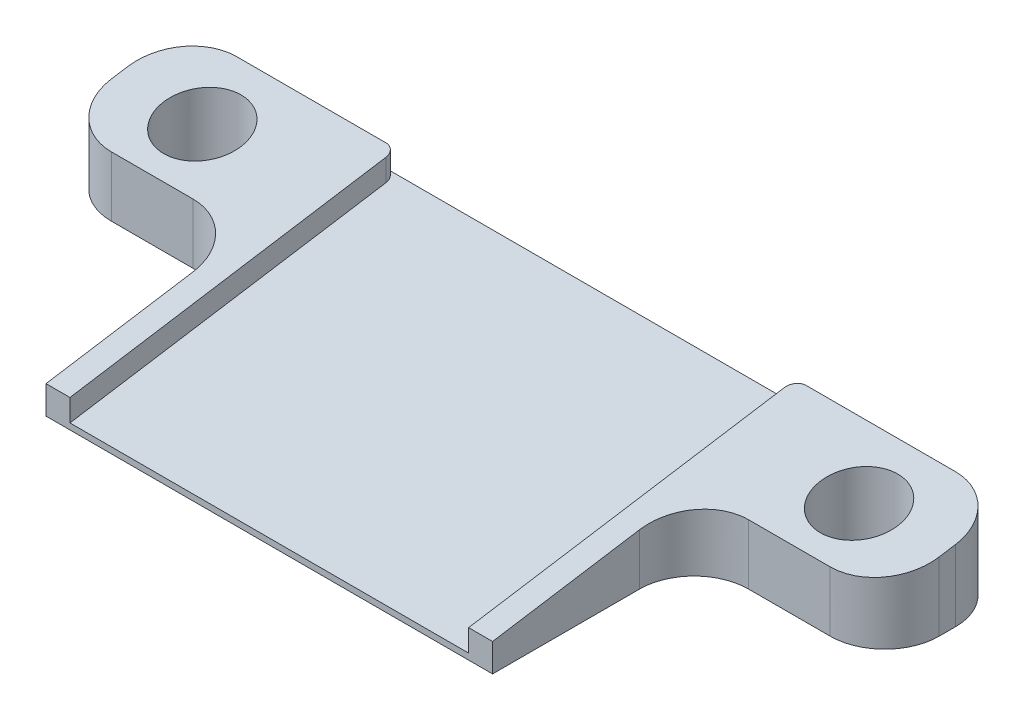
ISO-10303-21;
HEADER;
FILE_DESCRIPTION(('STEP AP214'),'2;1');
FILE_NAME('part.step','',(''),(''),'','','');
FILE_SCHEMA(('AUTOMOTIVE_DESIGN { 1 0 10303 214 1 1 1 1 }'));
ENDSEC;
DATA;
#1=APPLICATION_CONTEXT('core data for automotive mechanical design processes');
#2=APPLICATION_PROTOCOL_DEFINITION('international standard','automotive_design',2000,#1);
#3=PRODUCT_CONTEXT('',#1,'mechanical');
#4=PRODUCT('Part','Part','',(#3));
#5=PRODUCT_RELATED_PRODUCT_CATEGORY('part','',(#4));
#6=PRODUCT_DEFINITION_FORMATION('','',#4);
#7=PRODUCT_DEFINITION_CONTEXT('part definition',#1,'design');
#8=PRODUCT_DEFINITION('design','',#6,#7);
#9=PRODUCT_DEFINITION_SHAPE('','',#8);
#10=(LENGTH_UNIT() NAMED_UNIT(*) SI_UNIT(.MILLI.,.METRE.));
#11=(NAMED_UNIT(*) PLANE_ANGLE_UNIT() SI_UNIT($,.RADIAN.));
#12=(NAMED_UNIT(*) SI_UNIT($,.STERADIAN.) SOLID_ANGLE_UNIT());
#13=UNCERTAINTY_MEASURE_WITH_UNIT(LENGTH_MEASURE(1.E-05),#10,'distance_accuracy_value','');
#14=(GEOMETRIC_REPRESENTATION_CONTEXT(3) GLOBAL_UNCERTAINTY_ASSIGNED_CONTEXT((#13)) GLOBAL_UNIT_ASSIGNED_CONTEXT((#10,
#11,#12)) REPRESENTATION_CONTEXT('',''));
#15=CARTESIAN_POINT('',(0.,0.,0.));
#16=DIRECTION('',(0.,0.,1.));
#17=DIRECTION('',(1.,0.,0.));
#18=AXIS2_PLACEMENT_3D('',#15,#16,#17);
#19=CARTESIAN_POINT('',(0.,10.,-26.));
#20=DIRECTION('',(0.,0.,-1.));
#21=DIRECTION('',(-1.,0.,0.));
#22=AXIS2_PLACEMENT_3D('',#19,#20,#21);
#23=PLANE('',#22);
#24=DIRECTION('',(1.,0.,0.));
#25=VECTOR('',#24,1.);
#26=CARTESIAN_POINT('',(0.,5.31044736140546,-26.));
#27=LINE('',#26,#25);
#28=CARTESIAN_POINT('',(-19.3,5.31044736140546,-26.));
#29=VERTEX_POINT('',#28);
#30=CARTESIAN_POINT('',(19.3,5.31044736140546,-26.));
#31=VERTEX_POINT('',#30);
#32=EDGE_CURVE('E197',#29,#31,#27,.T.);
#33=ORIENTED_EDGE('',*,*,#32,.T.);
#34=DIRECTION('',(0.,-1.,0.));
#35=VECTOR('',#34,1.);
#36=CARTESIAN_POINT('',(19.3,7.33537761298147,-26.));
#37=LINE('',#36,#35);
#38=CARTESIAN_POINT('',(19.3,7.33537761298146,-26.));
#39=VERTEX_POINT('',#38);
#40=EDGE_CURVE('E317',#31,#39,#37,.F.);
#41=ORIENTED_EDGE('',*,*,#40,.T.);
#42=DIRECTION('',(1.,0.,0.));
#43=VECTOR('',#42,1.);
#44=CARTESIAN_POINT('',(-38.,7.33537761298146,-26.));
#45=LINE('',#44,#43);
#46=CARTESIAN_POINT('',(33.,7.33537761298146,-26.));
#47=VERTEX_POINT('',#46);
#48=EDGE_CURVE('E214',#39,#47,#45,.T.);
#49=ORIENTED_EDGE('',*,*,#48,.T.);
#50=DIRECTION('',(0.,-1.,0.));
#51=VECTOR('',#50,1.);
#52=CARTESIAN_POINT('',(33.,10.,-26.));
#53=LINE('',#52,#51);
#54=CARTESIAN_POINT('',(33.,0.,-26.));
#55=VERTEX_POINT('',#54);
#56=EDGE_CURVE('E282',#47,#55,#53,.T.);
#57=ORIENTED_EDGE('',*,*,#56,.T.);
#58=DIRECTION('',(1.,0.,0.));
#59=VECTOR('',#58,1.);
#60=CARTESIAN_POINT('',(0.,0.,-26.));
#61=LINE('',#60,#59);
#62=CARTESIAN_POINT('',(-33.,0.,-26.));
#63=VERTEX_POINT('',#62);
#64=EDGE_CURVE('E230',#63,#55,#61,.T.);
#65=ORIENTED_EDGE('',*,*,#64,.F.);
#66=DIRECTION('',(0.,-1.,0.));
#67=VECTOR('',#66,1.);
#68=CARTESIAN_POINT('',(-33.,7.33537761298146,-26.));
#69=LINE('',#68,#67);
#70=CARTESIAN_POINT('',(-33.,7.33537761298146,-26.));
#71=VERTEX_POINT('',#70);
#72=EDGE_CURVE('E280',#63,#71,#69,.F.);
#73=ORIENTED_EDGE('',*,*,#72,.T.);
#74=CARTESIAN_POINT('',(-19.3,7.33537761298146,-26.));
#75=VERTEX_POINT('',#74);
#76=EDGE_CURVE('E217',#71,#75,#45,.T.);
#77=ORIENTED_EDGE('',*,*,#76,.T.);
#78=DIRECTION('',(0.,-1.,0.));
#79=VECTOR('',#78,1.);
#80=CARTESIAN_POINT('',(-19.3,10.,-26.));
#81=LINE('',#80,#79);
#82=EDGE_CURVE('E314',#75,#29,#81,.T.);
#83=ORIENTED_EDGE('',*,*,#82,.T.);
#84=EDGE_LOOP('',(#33,#41,#49,#57,#65,#73,#77,#83));
#85=FACE_BOUND('',#84,.T.);
#86=ADVANCED_FACE('F37',(#85),#23,.T.);
#87=CARTESIAN_POINT('',(0.,0.,0.));
#88=DIRECTION('',(0.,1.,0.));
#89=DIRECTION('',(0.,0.,1.));
#90=AXIS2_PLACEMENT_3D('',#87,#88,#89);
#91=PLANE('',#90);
#92=CARTESIAN_POINT('',(-30.15,0.,-20.));
#93=DIRECTION('',(0.,1.,0.));
#94=DIRECTION('',(0.,0.,1.));
#95=AXIS2_PLACEMENT_3D('',#92,#93,#94);
#96=CIRCLE('',#95,3.55);
#97=CARTESIAN_POINT('',(-30.15,0.,-16.45));
#98=VERTEX_POINT('',#97);
#99=EDGE_CURVE('E236',#98,#98,#96,.T.);
#100=ORIENTED_EDGE('',*,*,#99,.T.);
#101=EDGE_LOOP('',(#100));
#102=FACE_BOUND('',#101,.T.);
#103=CARTESIAN_POINT('',(30.15,0.,-20.));
#104=DIRECTION('',(0.,1.,0.));
#105=DIRECTION('',(0.,0.,1.));
#106=AXIS2_PLACEMENT_3D('',#103,#104,#105);
#107=CIRCLE('',#106,3.55);
#108=CARTESIAN_POINT('',(30.15,0.,-16.45));
#109=VERTEX_POINT('',#108);
#110=EDGE_CURVE('E224',#109,#109,#107,.T.);
#111=ORIENTED_EDGE('',*,*,#110,.T.);
#112=EDGE_LOOP('',(#111));
#113=FACE_BOUND('',#112,.T.);
#114=DIRECTION('',(0.,0.,-1.));
#115=VECTOR('',#114,1.);
#116=CARTESIAN_POINT('',(20.5,0.,0.));
#117=LINE('',#116,#115);
#118=CARTESIAN_POINT('',(20.5,0.,4.));
#119=VERTEX_POINT('',#118);
#120=CARTESIAN_POINT('',(20.5,0.,-9.5));
#121=VERTEX_POINT('',#120);
#122=EDGE_CURVE('E188',#119,#121,#117,.T.);
#123=ORIENTED_EDGE('',*,*,#122,.F.);
#124=DIRECTION('',(1.,0.,0.));
#125=VECTOR('',#124,1.);
#126=CARTESIAN_POINT('',(-38.,0.,3.99999999999998));
#127=LINE('',#126,#125);
#128=CARTESIAN_POINT('',(-20.5,0.,3.99999999999998));
#129=VERTEX_POINT('',#128);
#130=EDGE_CURVE('E172',#129,#119,#127,.T.);
#131=ORIENTED_EDGE('',*,*,#130,.F.);
#132=DIRECTION('',(0.,0.,1.));
#133=VECTOR('',#132,1.);
#134=CARTESIAN_POINT('',(-20.5,0.,0.));
#135=LINE('',#134,#133);
#136=CARTESIAN_POINT('',(-20.5,0.,-9.5));
#137=VERTEX_POINT('',#136);
#138=EDGE_CURVE('E208',#137,#129,#135,.T.);
#139=ORIENTED_EDGE('',*,*,#138,.F.);
#140=CARTESIAN_POINT('',(-25.5,0.,-9.5));
#141=DIRECTION('',(0.,1.,0.));
#142=DIRECTION('',(0.,0.,1.));
#143=AXIS2_PLACEMENT_3D('',#140,#141,#142);
#144=CIRCLE('',#143,5.);
#145=CARTESIAN_POINT('',(-25.5,0.,-14.5));
#146=VERTEX_POINT('',#145);
#147=EDGE_CURVE('E307',#137,#146,#144,.T.);
#148=ORIENTED_EDGE('',*,*,#147,.T.);
#149=DIRECTION('',(1.,0.,0.));
#150=VECTOR('',#149,1.);
#151=CARTESIAN_POINT('',(0.,0.,-14.5));
#152=LINE('',#151,#150);
#153=CARTESIAN_POINT('',(-33.,0.,-14.5));
#154=VERTEX_POINT('',#153);
#155=EDGE_CURVE('E200',#154,#146,#152,.T.);
#156=ORIENTED_EDGE('',*,*,#155,.F.);
#157=CARTESIAN_POINT('',(-33.,0.,-19.5));
#158=DIRECTION('',(0.,1.,0.));
#159=DIRECTION('',(0.,0.,1.));
#160=AXIS2_PLACEMENT_3D('',#157,#158,#159);
#161=CIRCLE('',#160,5.);
#162=CARTESIAN_POINT('',(-38.,0.,-19.5));
#163=VERTEX_POINT('',#162);
#164=EDGE_CURVE('E262',#154,#163,#161,.F.);
#165=ORIENTED_EDGE('',*,*,#164,.T.);
#166=DIRECTION('',(0.,0.,1.));
#167=VECTOR('',#166,1.);
#168=CARTESIAN_POINT('',(-38.,0.,0.));
#169=LINE('',#168,#167);
#170=CARTESIAN_POINT('',(-38.,0.,-21.));
#171=VERTEX_POINT('',#170);
#172=EDGE_CURVE('E233',#171,#163,#169,.T.);
#173=ORIENTED_EDGE('',*,*,#172,.F.);
#174=CARTESIAN_POINT('',(-33.,0.,-21.));
#175=DIRECTION('',(0.,1.,0.));
#176=DIRECTION('',(0.,0.,1.));
#177=AXIS2_PLACEMENT_3D('',#174,#175,#176);
#178=CIRCLE('',#177,5.);
#179=EDGE_CURVE('E264',#171,#63,#178,.F.);
#180=ORIENTED_EDGE('',*,*,#179,.T.);
#181=ORIENTED_EDGE('',*,*,#64,.T.);
#182=CARTESIAN_POINT('',(33.,0.,-21.));
#183=DIRECTION('',(0.,1.,0.));
#184=DIRECTION('',(0.,0.,1.));
#185=AXIS2_PLACEMENT_3D('',#182,#183,#184);
#186=CIRCLE('',#185,5.);
#187=CARTESIAN_POINT('',(38.,0.,-21.));
#188=VERTEX_POINT('',#187);
#189=EDGE_CURVE('E266',#55,#188,#186,.F.);
#190=ORIENTED_EDGE('',*,*,#189,.T.);
#191=DIRECTION('',(0.,0.,1.));
#192=VECTOR('',#191,1.);
#193=CARTESIAN_POINT('',(38.,0.,0.));
#194=LINE('',#193,#192);
#195=CARTESIAN_POINT('',(38.,0.,-19.5));
#196=VERTEX_POINT('',#195);
#197=EDGE_CURVE('E227',#188,#196,#194,.T.);
#198=ORIENTED_EDGE('',*,*,#197,.T.);
#199=CARTESIAN_POINT('',(33.,0.,-19.5));
#200=DIRECTION('',(0.,1.,0.));
#201=DIRECTION('',(0.,0.,1.));
#202=AXIS2_PLACEMENT_3D('',#199,#200,#201);
#203=CIRCLE('',#202,5.);
#204=CARTESIAN_POINT('',(33.,0.,-14.5));
#205=VERTEX_POINT('',#204);
#206=EDGE_CURVE('E268',#196,#205,#203,.F.);
#207=ORIENTED_EDGE('',*,*,#206,.T.);
#208=DIRECTION('',(1.,0.,0.));
#209=VECTOR('',#208,1.);
#210=CARTESIAN_POINT('',(0.,0.,-14.5));
#211=LINE('',#210,#209);
#212=CARTESIAN_POINT('',(25.5,0.,-14.5));
#213=VERTEX_POINT('',#212);
#214=EDGE_CURVE('E196',#213,#205,#211,.T.);
#215=ORIENTED_EDGE('',*,*,#214,.F.);
#216=CARTESIAN_POINT('',(25.5,0.,-9.5));
#217=DIRECTION('',(0.,1.,0.));
#218=DIRECTION('',(0.,0.,1.));
#219=AXIS2_PLACEMENT_3D('',#216,#217,#218);
#220=CIRCLE('',#219,5.);
#221=EDGE_CURVE('E194',#213,#121,#220,.T.);
#222=ORIENTED_EDGE('',*,*,#221,.T.);
#223=EDGE_LOOP('',(#123,#131,#139,#148,#156,#165,#173,#180,#181,#190,#198,#207,#215,#222));
#224=FACE_BOUND('',#223,.T.);
#225=ADVANCED_FACE('F192',(#102,#113,#224),#91,.F.);
#226=CARTESIAN_POINT('',(-38.,3.13864721877221,0.4971128831214));
#227=DIRECTION('',(0.,-0.987688340595138,-0.156434465040231));
#228=DIRECTION('',(0.,0.156434465040231,-0.987688340595138));
#229=AXIS2_PLACEMENT_3D('',#226,#227,#228);
#230=PLANE('',#229);
#231=CARTESIAN_POINT('',(-30.15,6.38507097103424,-20.));
#232=DIRECTION('',(0.,-0.987688340595138,-0.156434465040231));
#233=DIRECTION('',(0.,-0.156434465040231,0.987688340595138));
#234=AXIS2_PLACEMENT_3D('',#231,#232,#233);
#235=ELLIPSE('',#234,3.59425119654741,3.55);
#236=CARTESIAN_POINT('',(-30.15,5.82280620788214,-16.45));
#237=VERTEX_POINT('',#236);
#238=EDGE_CURVE('E220',#237,#237,#235,.T.);
#239=ORIENTED_EDGE('',*,*,#238,.T.);
#240=EDGE_LOOP('',(#239));
#241=FACE_BOUND('',#240,.T.);
#242=DIRECTION('',(0.,-0.156434465040231,0.987688340595138));
#243=VECTOR('',#242,1.);
#244=CARTESIAN_POINT('',(-20.5,3.13864721877221,0.4971128831214));
#245=LINE('',#244,#243);
#246=CARTESIAN_POINT('',(-20.5,4.72203434762661,-9.5));
#247=VERTEX_POINT('',#246);
#248=CARTESIAN_POINT('',(-20.5,2.58384440324537,3.99999999999998));
#249=VERTEX_POINT('',#248);
#250=EDGE_CURVE('E239',#247,#249,#245,.T.);
#251=ORIENTED_EDGE('',*,*,#250,.T.);
#252=DIRECTION('',(1.,0.,0.));
#253=VECTOR('',#252,1.);
#254=CARTESIAN_POINT('',(-38.,2.58384440324537,3.99999999999998));
#255=LINE('',#254,#253);
#256=CARTESIAN_POINT('',(-18.3,2.58384440324537,3.99999999999999));
#257=VERTEX_POINT('',#256);
#258=EDGE_CURVE('E341',#249,#257,#255,.T.);
#259=ORIENTED_EDGE('',*,*,#258,.T.);
#260=DIRECTION('',(0.,-0.156434465040231,0.987688340595138));
#261=VECTOR('',#260,1.);
#262=CARTESIAN_POINT('',(-18.3,3.13864721877221,0.497112883121395));
#263=LINE('',#262,#261);
#264=CARTESIAN_POINT('',(-18.3,7.17699317265693,-25.));
#265=VERTEX_POINT('',#264);
#266=EDGE_CURVE('E254',#265,#257,#263,.T.);
#267=ORIENTED_EDGE('',*,*,#266,.F.);
#268=CARTESIAN_POINT('',(-19.3,7.17699317265693,-25.));
#269=DIRECTION('',(0.,-0.987688340595138,-0.156434465040231));
#270=DIRECTION('',(0.,-0.156434465040231,0.987688340595138));
#271=AXIS2_PLACEMENT_3D('',#268,#269,#270);
#272=ELLIPSE('',#271,1.012465125788,1.);
#273=EDGE_CURVE('E323',#265,#75,#272,.F.);
#274=ORIENTED_EDGE('',*,*,#273,.T.);
#275=ORIENTED_EDGE('',*,*,#76,.F.);
#276=CARTESIAN_POINT('',(-33.,6.54345541135878,-21.));
#277=DIRECTION('',(0.,-0.987688340595138,-0.156434465040231));
#278=DIRECTION('',(0.,0.156434465040231,-0.987688340595138));
#279=AXIS2_PLACEMENT_3D('',#276,#277,#278);
#280=ELLIPSE('',#279,5.06232562894001,5.);
#281=CARTESIAN_POINT('',(-38.,6.54345541135878,-21.));
#282=VERTEX_POINT('',#281);
#283=EDGE_CURVE('E294',#71,#282,#280,.F.);
#284=ORIENTED_EDGE('',*,*,#283,.T.);
#285=DIRECTION('',(0.,0.156434465040231,-0.987688340595138));
#286=VECTOR('',#285,1.);
#287=CARTESIAN_POINT('',(-38.,3.13864721877221,0.4971128831214));
#288=LINE('',#287,#286);
#289=CARTESIAN_POINT('',(-38.,6.30587875087198,-19.5));
#290=VERTEX_POINT('',#289);
#291=EDGE_CURVE('E211',#290,#282,#288,.T.);
#292=ORIENTED_EDGE('',*,*,#291,.F.);
#293=CARTESIAN_POINT('',(-33.,6.30587875087198,-19.5));
#294=DIRECTION('',(0.,-0.987688340595138,-0.156434465040231));
#295=DIRECTION('',(0.,-0.156434465040231,0.987688340595138));
#296=AXIS2_PLACEMENT_3D('',#293,#294,#295);
#297=ELLIPSE('',#296,5.06232562894001,5.);
#298=CARTESIAN_POINT('',(-33.,5.51395654924929,-14.5));
#299=VERTEX_POINT('',#298);
#300=EDGE_CURVE('E292',#290,#299,#297,.F.);
#301=ORIENTED_EDGE('',*,*,#300,.T.);
#302=DIRECTION('',(1.,0.,0.));
#303=VECTOR('',#302,1.);
#304=CARTESIAN_POINT('',(-38.,5.51395654924929,-14.5));
#305=LINE('',#304,#303);
#306=CARTESIAN_POINT('',(-25.5,5.51395654924929,-14.5));
#307=VERTEX_POINT('',#306);
#308=EDGE_CURVE('E244',#299,#307,#305,.T.);
#309=ORIENTED_EDGE('',*,*,#308,.T.);
#310=CARTESIAN_POINT('',(-25.5,4.72203434762661,-9.5));
#311=DIRECTION('',(0.,-0.987688340595138,-0.156434465040231));
#312=DIRECTION('',(0.,0.156434465040231,-0.987688340595138));
#313=AXIS2_PLACEMENT_3D('',#310,#311,#312);
#314=ELLIPSE('',#313,5.06232562894001,5.);
#315=EDGE_CURVE('E309',#307,#247,#314,.T.);
#316=ORIENTED_EDGE('',*,*,#315,.T.);
#317=EDGE_LOOP('',(#251,#259,#267,#274,#275,#284,#292,#301,#309,#316));
#318=FACE_BOUND('',#317,.T.);
#319=ADVANCED_FACE('F339',(#241,#318),#230,.F.);
#320=CARTESIAN_POINT('',(38.,10.,0.));
#321=DIRECTION('',(1.,0.,0.));
#322=DIRECTION('',(0.,0.,-1.));
#323=AXIS2_PLACEMENT_3D('',#320,#321,#322);
#324=PLANE('',#323);
#325=DIRECTION('',(0.,0.156434465040231,-0.987688340595138));
#326=VECTOR('',#325,1.);
#327=CARTESIAN_POINT('',(38.,3.13864721877221,0.4971128831214));
#328=LINE('',#327,#326);
#329=CARTESIAN_POINT('',(38.,6.30587875087198,-19.5));
#330=VERTEX_POINT('',#329);
#331=CARTESIAN_POINT('',(38.,6.54345541135878,-21.));
#332=VERTEX_POINT('',#331);
#333=EDGE_CURVE('E210',#330,#332,#328,.T.);
#334=ORIENTED_EDGE('',*,*,#333,.F.);
#335=DIRECTION('',(0.,-1.,0.));
#336=VECTOR('',#335,1.);
#337=CARTESIAN_POINT('',(38.,0.,-19.5));
#338=LINE('',#337,#336);
#339=EDGE_CURVE('E259',#330,#196,#338,.T.);
#340=ORIENTED_EDGE('',*,*,#339,.T.);
#341=ORIENTED_EDGE('',*,*,#197,.F.);
#342=DIRECTION('',(0.,-1.,0.));
#343=VECTOR('',#342,1.);
#344=CARTESIAN_POINT('',(38.,10.,-21.));
#345=LINE('',#344,#343);
#346=EDGE_CURVE('E257',#188,#332,#345,.F.);
#347=ORIENTED_EDGE('',*,*,#346,.T.);
#348=EDGE_LOOP('',(#334,#340,#341,#347));
#349=FACE_BOUND('',#348,.T.);
#350=ADVANCED_FACE('F412',(#349),#324,.T.);
#351=CARTESIAN_POINT('',(-38.,10.,0.));
#352=DIRECTION('',(1.,0.,0.));
#353=DIRECTION('',(0.,0.,-1.));
#354=AXIS2_PLACEMENT_3D('',#351,#352,#353);
#355=PLANE('',#354);
#356=ORIENTED_EDGE('',*,*,#291,.T.);
#357=DIRECTION('',(0.,-1.,0.));
#358=VECTOR('',#357,1.);
#359=CARTESIAN_POINT('',(-38.,0.,-21.));
#360=LINE('',#359,#358);
#361=EDGE_CURVE('E289',#282,#171,#360,.T.);
#362=ORIENTED_EDGE('',*,*,#361,.T.);
#363=ORIENTED_EDGE('',*,*,#172,.T.);
#364=DIRECTION('',(0.,-1.,0.));
#365=VECTOR('',#364,1.);
#366=CARTESIAN_POINT('',(-38.,10.,-19.5));
#367=LINE('',#366,#365);
#368=EDGE_CURVE('E287',#163,#290,#367,.F.);
#369=ORIENTED_EDGE('',*,*,#368,.T.);
#370=EDGE_LOOP('',(#356,#362,#363,#369));
#371=FACE_BOUND('',#370,.T.);
#372=ADVANCED_FACE('F374',(#371),#355,.F.);
#373=CARTESIAN_POINT('',(30.15,10.,-20.));
#374=DIRECTION('',(0.,-1.,0.));
#375=DIRECTION('',(0.,0.,-1.));
#376=AXIS2_PLACEMENT_3D('',#373,#374,#375);
#377=CYLINDRICAL_SURFACE('',#376,3.55);
#378=CARTESIAN_POINT('',(30.15,6.38507097103424,-20.));
#379=DIRECTION('',(0.,-0.987688340595138,-0.156434465040231));
#380=DIRECTION('',(0.,-0.156434465040231,0.987688340595138));
#381=AXIS2_PLACEMENT_3D('',#378,#379,#380);
#382=ELLIPSE('',#381,3.59425119654741,3.55);
#383=CARTESIAN_POINT('',(30.15,5.82280620788214,-16.45));
#384=VERTEX_POINT('',#383);
#385=EDGE_CURVE('E221',#384,#384,#382,.T.);
#386=ORIENTED_EDGE('',*,*,#385,.F.);
#387=EDGE_LOOP('',(#386));
#388=FACE_BOUND('',#387,.T.);
#389=ORIENTED_EDGE('',*,*,#110,.F.);
#390=EDGE_LOOP('',(#389));
#391=FACE_BOUND('',#390,.T.);
#392=ADVANCED_FACE('F416',(#388,#391),#377,.F.);
#393=CARTESIAN_POINT('',(-30.15,10.,-20.));
#394=DIRECTION('',(0.,-1.,0.));
#395=DIRECTION('',(0.,0.,-1.));
#396=AXIS2_PLACEMENT_3D('',#393,#394,#395);
#397=CYLINDRICAL_SURFACE('',#396,3.55);
#398=ORIENTED_EDGE('',*,*,#238,.F.);
#399=EDGE_LOOP('',(#398));
#400=FACE_BOUND('',#399,.T.);
#401=ORIENTED_EDGE('',*,*,#99,.F.);
#402=EDGE_LOOP('',(#401));
#403=FACE_BOUND('',#402,.T.);
#404=ADVANCED_FACE('F419',(#400,#403),#397,.F.);
#405=ORIENTED_EDGE('',*,*,#385,.T.);
#406=EDGE_LOOP('',(#405));
#407=FACE_BOUND('',#406,.T.);
#408=DIRECTION('',(0.,-0.156434465040231,0.987688340595138));
#409=VECTOR('',#408,1.);
#410=CARTESIAN_POINT('',(18.3,3.13864721877221,0.497112883121405));
#411=LINE('',#410,#409);
#412=CARTESIAN_POINT('',(18.3,7.17699317265693,-25.));
#413=VERTEX_POINT('',#412);
#414=CARTESIAN_POINT('',(18.3,2.58384440324537,4.));
#415=VERTEX_POINT('',#414);
#416=EDGE_CURVE('E251',#413,#415,#411,.T.);
#417=ORIENTED_EDGE('',*,*,#416,.T.);
#418=DIRECTION('',(1.,0.,0.));
#419=VECTOR('',#418,1.);
#420=CARTESIAN_POINT('',(-38.,2.58384440324537,3.99999999999998));
#421=LINE('',#420,#419);
#422=CARTESIAN_POINT('',(20.5,2.58384440324537,4.));
#423=VERTEX_POINT('',#422);
#424=EDGE_CURVE('E52',#415,#423,#421,.T.);
#425=ORIENTED_EDGE('',*,*,#424,.T.);
#426=DIRECTION('',(0.,0.156434465040231,-0.987688340595138));
#427=VECTOR('',#426,1.);
#428=CARTESIAN_POINT('',(20.5,3.13864721877221,0.497112883121421));
#429=LINE('',#428,#427);
#430=CARTESIAN_POINT('',(20.5,4.72203434762661,-9.5));
#431=VERTEX_POINT('',#430);
#432=EDGE_CURVE('E190',#423,#431,#429,.T.);
#433=ORIENTED_EDGE('',*,*,#432,.T.);
#434=CARTESIAN_POINT('',(25.5,4.72203434762661,-9.5));
#435=DIRECTION('',(0.,-0.987688340595138,-0.156434465040231));
#436=DIRECTION('',(0.,0.156434465040231,-0.987688340595138));
#437=AXIS2_PLACEMENT_3D('',#434,#435,#436);
#438=ELLIPSE('',#437,5.06232562894001,5.);
#439=CARTESIAN_POINT('',(25.5,5.51395654924929,-14.5));
#440=VERTEX_POINT('',#439);
#441=EDGE_CURVE('E305',#431,#440,#438,.T.);
#442=ORIENTED_EDGE('',*,*,#441,.T.);
#443=DIRECTION('',(1.,0.,0.));
#444=VECTOR('',#443,1.);
#445=CARTESIAN_POINT('',(-38.,5.51395654924929,-14.5));
#446=LINE('',#445,#444);
#447=CARTESIAN_POINT('',(33.,5.51395654924929,-14.5));
#448=VERTEX_POINT('',#447);
#449=EDGE_CURVE('E247',#440,#448,#446,.T.);
#450=ORIENTED_EDGE('',*,*,#449,.T.);
#451=CARTESIAN_POINT('',(33.,6.30587875087198,-19.5));
#452=DIRECTION('',(0.,-0.987688340595138,-0.156434465040231));
#453=DIRECTION('',(0.,0.156434465040231,-0.987688340595138));
#454=AXIS2_PLACEMENT_3D('',#451,#452,#453);
#455=ELLIPSE('',#454,5.06232562894001,5.);
#456=EDGE_CURVE('E278',#448,#330,#455,.F.);
#457=ORIENTED_EDGE('',*,*,#456,.T.);
#458=ORIENTED_EDGE('',*,*,#333,.T.);
#459=CARTESIAN_POINT('',(33.,6.54345541135878,-21.));
#460=DIRECTION('',(0.,-0.987688340595138,-0.156434465040231));
#461=DIRECTION('',(0.,-0.156434465040231,0.987688340595138));
#462=AXIS2_PLACEMENT_3D('',#459,#460,#461);
#463=ELLIPSE('',#462,5.06232562894001,5.);
#464=EDGE_CURVE('E275',#332,#47,#463,.F.);
#465=ORIENTED_EDGE('',*,*,#464,.T.);
#466=ORIENTED_EDGE('',*,*,#48,.F.);
#467=CARTESIAN_POINT('',(19.3,7.17699317265693,-25.));
#468=DIRECTION('',(0.,-0.987688340595138,-0.156434465040231));
#469=DIRECTION('',(0.,0.156434465040231,-0.987688340595138));
#470=AXIS2_PLACEMENT_3D('',#467,#468,#469);
#471=ELLIPSE('',#470,1.012465125788,1.);
#472=EDGE_CURVE('E319',#39,#413,#471,.F.);
#473=ORIENTED_EDGE('',*,*,#472,.T.);
#474=EDGE_LOOP('',(#417,#425,#433,#442,#450,#457,#458,#465,#466,#473));
#475=FACE_BOUND('',#474,.T.);
#476=ADVANCED_FACE('F360',(#407,#475),#230,.F.);
#477=CARTESIAN_POINT('',(0.,7.33537761298146,-14.5));
#478=DIRECTION('',(0.,0.,-1.));
#479=DIRECTION('',(-1.,0.,0.));
#480=AXIS2_PLACEMENT_3D('',#477,#478,#479);
#481=PLANE('',#480);
#482=ORIENTED_EDGE('',*,*,#308,.F.);
#483=DIRECTION('',(0.,-1.,0.));
#484=VECTOR('',#483,1.);
#485=CARTESIAN_POINT('',(-33.,7.33537761298146,-14.5));
#486=LINE('',#485,#484);
#487=EDGE_CURVE('E298',#299,#154,#486,.T.);
#488=ORIENTED_EDGE('',*,*,#487,.T.);
#489=ORIENTED_EDGE('',*,*,#155,.T.);
#490=DIRECTION('',(0.,-1.,0.));
#491=VECTOR('',#490,1.);
#492=CARTESIAN_POINT('',(-25.5,5.51395654924929,-14.5));
#493=LINE('',#492,#491);
#494=EDGE_CURVE('E296',#146,#307,#493,.F.);
#495=ORIENTED_EDGE('',*,*,#494,.T.);
#496=EDGE_LOOP('',(#482,#488,#489,#495));
#497=FACE_BOUND('',#496,.T.);
#498=ADVANCED_FACE('F383',(#497),#481,.F.);
#499=CARTESIAN_POINT('',(-20.5,7.33537761298146,0.));
#500=DIRECTION('',(1.,0.,0.));
#501=DIRECTION('',(0.,0.,-1.));
#502=AXIS2_PLACEMENT_3D('',#499,#500,#501);
#503=PLANE('',#502);
#504=ORIENTED_EDGE('',*,*,#138,.T.);
#505=DIRECTION('',(0.,1.,0.));
#506=VECTOR('',#505,1.);
#507=CARTESIAN_POINT('',(-20.5,7.33537761298146,3.99999999999998));
#508=LINE('',#507,#506);
#509=EDGE_CURVE('E177',#129,#249,#508,.T.);
#510=ORIENTED_EDGE('',*,*,#509,.T.);
#511=ORIENTED_EDGE('',*,*,#250,.F.);
#512=DIRECTION('',(0.,-1.,0.));
#513=VECTOR('',#512,1.);
#514=CARTESIAN_POINT('',(-20.5,0.,-9.5));
#515=LINE('',#514,#513);
#516=EDGE_CURVE('E301',#247,#137,#515,.T.);
#517=ORIENTED_EDGE('',*,*,#516,.T.);
#518=EDGE_LOOP('',(#504,#510,#511,#517));
#519=FACE_BOUND('',#518,.T.);
#520=ADVANCED_FACE('F390',(#519),#503,.F.);
#521=CARTESIAN_POINT('',(20.5,7.33537761298146,0.));
#522=DIRECTION('',(-1.,0.,0.));
#523=DIRECTION('',(0.,0.,1.));
#524=AXIS2_PLACEMENT_3D('',#521,#522,#523);
#525=PLANE('',#524);
#526=ORIENTED_EDGE('',*,*,#432,.F.);
#527=DIRECTION('',(0.,1.,0.));
#528=VECTOR('',#527,1.);
#529=CARTESIAN_POINT('',(20.5,0.,4.));
#530=LINE('',#529,#528);
#531=EDGE_CURVE('E175',#119,#423,#530,.T.);
#532=ORIENTED_EDGE('',*,*,#531,.F.);
#533=ORIENTED_EDGE('',*,*,#122,.T.);
#534=DIRECTION('',(0.,-1.,0.));
#535=VECTOR('',#534,1.);
#536=CARTESIAN_POINT('',(20.5,5.51395654924929,-9.5));
#537=LINE('',#536,#535);
#538=EDGE_CURVE('E285',#121,#431,#537,.F.);
#539=ORIENTED_EDGE('',*,*,#538,.T.);
#540=EDGE_LOOP('',(#526,#532,#533,#539));
#541=FACE_BOUND('',#540,.T.);
#542=ADVANCED_FACE('F186',(#541),#525,.F.);
#543=CARTESIAN_POINT('',(0.,7.33537761298146,-14.5));
#544=DIRECTION('',(0.,0.,-1.));
#545=DIRECTION('',(-1.,0.,0.));
#546=AXIS2_PLACEMENT_3D('',#543,#544,#545);
#547=PLANE('',#546);
#548=ORIENTED_EDGE('',*,*,#214,.T.);
#549=DIRECTION('',(0.,-1.,0.));
#550=VECTOR('',#549,1.);
#551=CARTESIAN_POINT('',(33.,5.51395654924929,-14.5));
#552=LINE('',#551,#550);
#553=EDGE_CURVE('E273',#205,#448,#552,.F.);
#554=ORIENTED_EDGE('',*,*,#553,.T.);
#555=ORIENTED_EDGE('',*,*,#449,.F.);
#556=DIRECTION('',(0.,-1.,0.));
#557=VECTOR('',#556,1.);
#558=CARTESIAN_POINT('',(25.5,0.,-14.5));
#559=LINE('',#558,#557);
#560=EDGE_CURVE('E270',#440,#213,#559,.T.);
#561=ORIENTED_EDGE('',*,*,#560,.T.);
#562=EDGE_LOOP('',(#548,#554,#555,#561));
#563=FACE_BOUND('',#562,.T.);
#564=ADVANCED_FACE('F397',(#563),#547,.F.);
#565=CARTESIAN_POINT('',(0.,1.16327053758194,0.184243953040938));
#566=DIRECTION('',(0.,0.987688340595138,0.156434465040231));
#567=DIRECTION('',(0.,-0.156434465040231,0.987688340595138));
#568=AXIS2_PLACEMENT_3D('',#565,#566,#567);
#569=PLANE('',#568);
#570=DIRECTION('',(-1.,0.,0.));
#571=VECTOR('',#570,1.);
#572=CARTESIAN_POINT('',(0.,0.558914151669363,3.99999999999999));
#573=LINE('',#572,#571);
#574=CARTESIAN_POINT('',(18.3,0.558914151669363,4.));
#575=VERTEX_POINT('',#574);
#576=CARTESIAN_POINT('',(-18.3,0.558914151669364,3.99999999999998));
#577=VERTEX_POINT('',#576);
#578=EDGE_CURVE('E182',#575,#577,#573,.T.);
#579=ORIENTED_EDGE('',*,*,#578,.F.);
#580=DIRECTION('',(0.,0.156434465040231,-0.987688340595138));
#581=VECTOR('',#580,1.);
#582=CARTESIAN_POINT('',(18.3,1.16327053758194,0.18424395304094));
#583=LINE('',#582,#581);
#584=CARTESIAN_POINT('',(18.3,5.15206292108093,-25.));
#585=VERTEX_POINT('',#584);
#586=EDGE_CURVE('E202',#575,#585,#583,.T.);
#587=ORIENTED_EDGE('',*,*,#586,.T.);
#588=CARTESIAN_POINT('',(19.3,5.15206292108093,-25.));
#589=DIRECTION('',(0.,0.987688340595138,0.156434465040231));
#590=DIRECTION('',(0.,0.156434465040231,-0.987688340595138));
#591=AXIS2_PLACEMENT_3D('',#588,#589,#590);
#592=ELLIPSE('',#591,1.012465125788,1.);
#593=EDGE_CURVE('E325',#585,#31,#592,.F.);
#594=ORIENTED_EDGE('',*,*,#593,.T.);
#595=ORIENTED_EDGE('',*,*,#32,.F.);
#596=CARTESIAN_POINT('',(-19.3,5.15206292108093,-25.));
#597=DIRECTION('',(0.,0.987688340595138,0.156434465040231));
#598=DIRECTION('',(0.,-0.156434465040231,0.987688340595138));
#599=AXIS2_PLACEMENT_3D('',#596,#597,#598);
#600=ELLIPSE('',#599,1.012465125788,1.);
#601=CARTESIAN_POINT('',(-18.3,5.15206292108093,-25.));
#602=VERTEX_POINT('',#601);
#603=EDGE_CURVE('E45',#29,#602,#600,.F.);
#604=ORIENTED_EDGE('',*,*,#603,.T.);
#605=DIRECTION('',(0.,0.156434465040231,-0.987688340595138));
#606=VECTOR('',#605,1.);
#607=CARTESIAN_POINT('',(-18.3,1.16327053758194,0.184243953040943));
#608=LINE('',#607,#606);
#609=EDGE_CURVE('E59',#577,#602,#608,.T.);
#610=ORIENTED_EDGE('',*,*,#609,.F.);
#611=EDGE_LOOP('',(#579,#587,#594,#595,#604,#610));
#612=FACE_BOUND('',#611,.T.);
#613=ADVANCED_FACE('F331',(#612),#569,.T.);
#614=CARTESIAN_POINT('',(-18.3,1.16327053758194,0.184243953040943));
#615=DIRECTION('',(1.,0.,0.));
#616=DIRECTION('',(0.,0.,-1.));
#617=AXIS2_PLACEMENT_3D('',#614,#615,#616);
#618=PLANE('',#617);
#619=DIRECTION('',(0.,1.,0.));
#620=VECTOR('',#619,1.);
#621=CARTESIAN_POINT('',(-18.3,1.16327053758194,3.99999999999999));
#622=LINE('',#621,#620);
#623=EDGE_CURVE('E343',#577,#257,#622,.T.);
#624=ORIENTED_EDGE('',*,*,#623,.F.);
#625=ORIENTED_EDGE('',*,*,#609,.T.);
#626=DIRECTION('',(0.,-1.,0.));
#627=VECTOR('',#626,1.);
#628=CARTESIAN_POINT('',(-18.3,1.16327053758194,-25.));
#629=LINE('',#628,#627);
#630=EDGE_CURVE('E321',#602,#265,#629,.F.);
#631=ORIENTED_EDGE('',*,*,#630,.T.);
#632=ORIENTED_EDGE('',*,*,#266,.T.);
#633=EDGE_LOOP('',(#624,#625,#631,#632));
#634=FACE_BOUND('',#633,.T.);
#635=ADVANCED_FACE('F336',(#634),#618,.T.);
#636=CARTESIAN_POINT('',(18.3,1.16327053758194,0.18424395304094));
#637=DIRECTION('',(1.,0.,0.));
#638=DIRECTION('',(0.,0.,-1.));
#639=AXIS2_PLACEMENT_3D('',#636,#637,#638);
#640=PLANE('',#639);
#641=ORIENTED_EDGE('',*,*,#586,.F.);
#642=DIRECTION('',(0.,1.,0.));
#643=VECTOR('',#642,1.);
#644=CARTESIAN_POINT('',(18.3,1.16327053758194,4.));
#645=LINE('',#644,#643);
#646=EDGE_CURVE('E11',#575,#415,#645,.T.);
#647=ORIENTED_EDGE('',*,*,#646,.T.);
#648=ORIENTED_EDGE('',*,*,#416,.F.);
#649=DIRECTION('',(0.,-1.,0.));
#650=VECTOR('',#649,1.);
#651=CARTESIAN_POINT('',(18.3,5.31044736140546,-25.));
#652=LINE('',#651,#650);
#653=EDGE_CURVE('E311',#413,#585,#652,.T.);
#654=ORIENTED_EDGE('',*,*,#653,.T.);
#655=EDGE_LOOP('',(#641,#647,#648,#654));
#656=FACE_BOUND('',#655,.T.);
#657=ADVANCED_FACE('F358',(#656),#640,.F.);
#658=CARTESIAN_POINT('',(33.,10.,-19.5));
#659=DIRECTION('',(0.,1.,0.));
#660=DIRECTION('',(0.,0.,1.));
#661=AXIS2_PLACEMENT_3D('',#658,#659,#660);
#662=CYLINDRICAL_SURFACE('',#661,5.);
#663=ORIENTED_EDGE('',*,*,#456,.F.);
#664=ORIENTED_EDGE('',*,*,#553,.F.);
#665=ORIENTED_EDGE('',*,*,#206,.F.);
#666=ORIENTED_EDGE('',*,*,#339,.F.);
#667=EDGE_LOOP('',(#663,#664,#665,#666));
#668=FACE_BOUND('',#667,.T.);
#669=ADVANCED_FACE('F421',(#668),#662,.T.);
#670=CARTESIAN_POINT('',(33.,10.,-21.));
#671=DIRECTION('',(0.,-1.,0.));
#672=DIRECTION('',(0.,0.,-1.));
#673=AXIS2_PLACEMENT_3D('',#670,#671,#672);
#674=CYLINDRICAL_SURFACE('',#673,5.);
#675=ORIENTED_EDGE('',*,*,#464,.F.);
#676=ORIENTED_EDGE('',*,*,#346,.F.);
#677=ORIENTED_EDGE('',*,*,#189,.F.);
#678=ORIENTED_EDGE('',*,*,#56,.F.);
#679=EDGE_LOOP('',(#675,#676,#677,#678));
#680=FACE_BOUND('',#679,.T.);
#681=ADVANCED_FACE('F424',(#680),#674,.T.);
#682=CARTESIAN_POINT('',(25.5,7.33537761298146,-9.5));
#683=DIRECTION('',(0.,1.,0.));
#684=DIRECTION('',(0.,0.,1.));
#685=AXIS2_PLACEMENT_3D('',#682,#683,#684);
#686=CYLINDRICAL_SURFACE('',#685,5.);
#687=ORIENTED_EDGE('',*,*,#441,.F.);
#688=ORIENTED_EDGE('',*,*,#538,.F.);
#689=ORIENTED_EDGE('',*,*,#221,.F.);
#690=ORIENTED_EDGE('',*,*,#560,.F.);
#691=EDGE_LOOP('',(#687,#688,#689,#690));
#692=FACE_BOUND('',#691,.T.);
#693=ADVANCED_FACE('F428',(#692),#686,.F.);
#694=CARTESIAN_POINT('',(-33.,10.,-21.));
#695=DIRECTION('',(0.,1.,0.));
#696=DIRECTION('',(0.,0.,1.));
#697=AXIS2_PLACEMENT_3D('',#694,#695,#696);
#698=CYLINDRICAL_SURFACE('',#697,5.);
#699=ORIENTED_EDGE('',*,*,#283,.F.);
#700=ORIENTED_EDGE('',*,*,#72,.F.);
#701=ORIENTED_EDGE('',*,*,#179,.F.);
#702=ORIENTED_EDGE('',*,*,#361,.F.);
#703=EDGE_LOOP('',(#699,#700,#701,#702));
#704=FACE_BOUND('',#703,.T.);
#705=ADVANCED_FACE('F371',(#704),#698,.T.);
#706=CARTESIAN_POINT('',(-33.,7.33537761298146,-19.5));
#707=DIRECTION('',(0.,-1.,0.));
#708=DIRECTION('',(0.,0.,-1.));
#709=AXIS2_PLACEMENT_3D('',#706,#707,#708);
#710=CYLINDRICAL_SURFACE('',#709,5.);
#711=ORIENTED_EDGE('',*,*,#300,.F.);
#712=ORIENTED_EDGE('',*,*,#368,.F.);
#713=ORIENTED_EDGE('',*,*,#164,.F.);
#714=ORIENTED_EDGE('',*,*,#487,.F.);
#715=EDGE_LOOP('',(#711,#712,#713,#714));
#716=FACE_BOUND('',#715,.T.);
#717=ADVANCED_FACE('F380',(#716),#710,.T.);
#718=CARTESIAN_POINT('',(-25.5,7.33537761298146,-9.5));
#719=DIRECTION('',(0.,1.,0.));
#720=DIRECTION('',(0.,0.,1.));
#721=AXIS2_PLACEMENT_3D('',#718,#719,#720);
#722=CYLINDRICAL_SURFACE('',#721,5.);
#723=ORIENTED_EDGE('',*,*,#315,.F.);
#724=ORIENTED_EDGE('',*,*,#494,.F.);
#725=ORIENTED_EDGE('',*,*,#147,.F.);
#726=ORIENTED_EDGE('',*,*,#516,.F.);
#727=EDGE_LOOP('',(#723,#724,#725,#726));
#728=FACE_BOUND('',#727,.T.);
#729=ADVANCED_FACE('F388',(#728),#722,.F.);
#730=CARTESIAN_POINT('',(19.3,1.16327053758194,-25.));
#731=DIRECTION('',(0.,1.,0.));
#732=DIRECTION('',(-1.,0.,0.));
#733=AXIS2_PLACEMENT_3D('',#730,#731,#732);
#734=CYLINDRICAL_SURFACE('',#733,1.);
#735=ORIENTED_EDGE('',*,*,#472,.F.);
#736=ORIENTED_EDGE('',*,*,#40,.F.);
#737=ORIENTED_EDGE('',*,*,#593,.F.);
#738=ORIENTED_EDGE('',*,*,#653,.F.);
#739=EDGE_LOOP('',(#735,#736,#737,#738));
#740=FACE_BOUND('',#739,.T.);
#741=ADVANCED_FACE('F356',(#740),#734,.T.);
#742=CARTESIAN_POINT('',(-19.3,10.,-25.));
#743=DIRECTION('',(0.,-1.,0.));
#744=DIRECTION('',(1.,0.,0.));
#745=AXIS2_PLACEMENT_3D('',#742,#743,#744);
#746=CYLINDRICAL_SURFACE('',#745,1.);
#747=ORIENTED_EDGE('',*,*,#273,.F.);
#748=ORIENTED_EDGE('',*,*,#630,.F.);
#749=ORIENTED_EDGE('',*,*,#603,.F.);
#750=ORIENTED_EDGE('',*,*,#82,.F.);
#751=EDGE_LOOP('',(#747,#748,#749,#750));
#752=FACE_BOUND('',#751,.T.);
#753=ADVANCED_FACE('F39',(#752),#746,.T.);
#754=CARTESIAN_POINT('',(-38.,0.,3.99999999999998));
#755=DIRECTION('',(0.,0.,-1.));
#756=DIRECTION('',(-1.,0.,0.));
#757=AXIS2_PLACEMENT_3D('',#754,#755,#756);
#758=PLANE('',#757);
#759=ORIENTED_EDGE('',*,*,#130,.T.);
#760=ORIENTED_EDGE('',*,*,#531,.T.);
#761=ORIENTED_EDGE('',*,*,#424,.F.);
#762=ORIENTED_EDGE('',*,*,#646,.F.);
#763=ORIENTED_EDGE('',*,*,#578,.T.);
#764=ORIENTED_EDGE('',*,*,#623,.T.);
#765=ORIENTED_EDGE('',*,*,#258,.F.);
#766=ORIENTED_EDGE('',*,*,#509,.F.);
#767=EDGE_LOOP('',(#759,#760,#761,#762,#763,#764,#765,#766));
#768=FACE_BOUND('',#767,.T.);
#769=ADVANCED_FACE('F174',(#768),#758,.F.);
#770=CLOSED_SHELL('',(#86,#225,#319,#350,#372,#392,#404,#476,#498,#520,#542,#564,#613,#635,#657,
#669,#681,#693,#705,#717,#729,#741,#753,#769));
#771=MANIFOLD_SOLID_BREP('B2',#770);
#772=ADVANCED_BREP_SHAPE_REPRESENTATION('',(#18,#771),#14);
#773=SHAPE_DEFINITION_REPRESENTATION(#9,#772);
ENDSEC;
END-ISO-10303-21;
